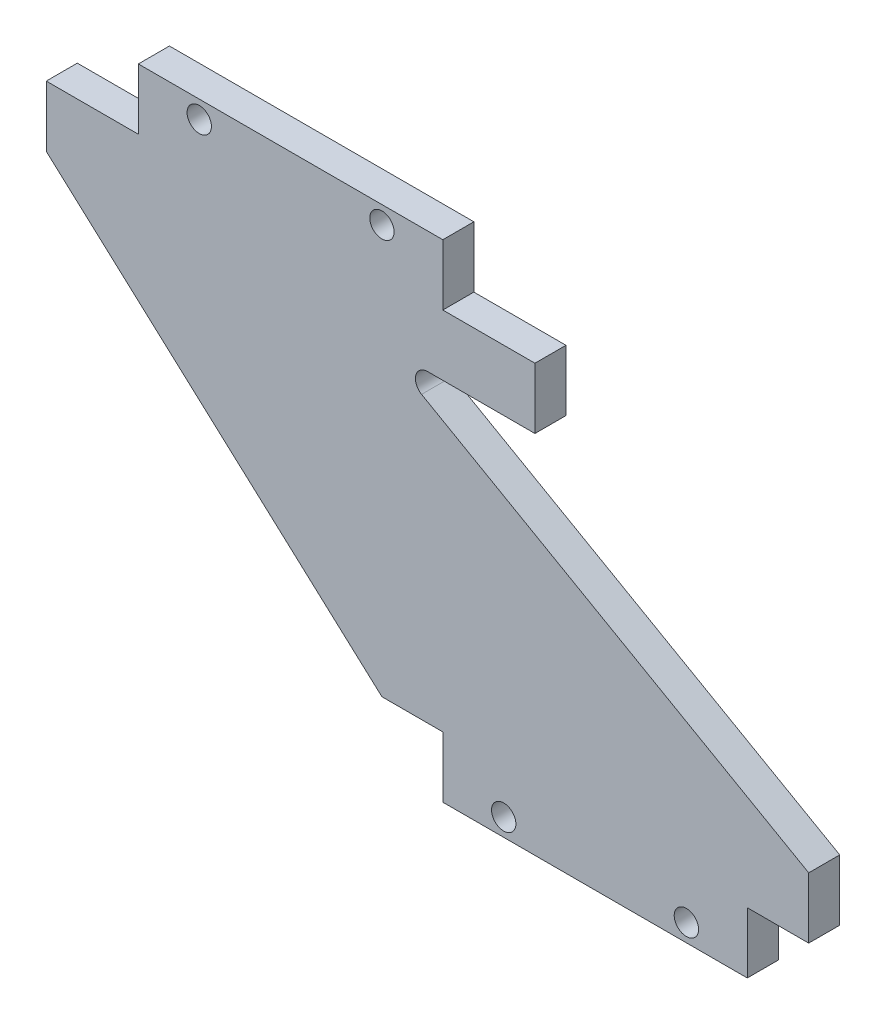
ISO-10303-21;
HEADER;
FILE_DESCRIPTION(('STEP AP214'),'2;1');
FILE_NAME('part.step','',(''),(''),'','','');
FILE_SCHEMA(('AUTOMOTIVE_DESIGN { 1 0 10303 214 1 1 1 1 }'));
ENDSEC;
DATA;
#1=APPLICATION_CONTEXT('core data for automotive mechanical design processes');
#2=APPLICATION_PROTOCOL_DEFINITION('international standard','automotive_design',2000,#1);
#3=PRODUCT_CONTEXT('',#1,'mechanical');
#4=PRODUCT('Part','Part','',(#3));
#5=PRODUCT_RELATED_PRODUCT_CATEGORY('part','',(#4));
#6=PRODUCT_DEFINITION_FORMATION('','',#4);
#7=PRODUCT_DEFINITION_CONTEXT('part definition',#1,'design');
#8=PRODUCT_DEFINITION('design','',#6,#7);
#9=PRODUCT_DEFINITION_SHAPE('','',#8);
#10=(LENGTH_UNIT() NAMED_UNIT(*) SI_UNIT(.MILLI.,.METRE.));
#11=(NAMED_UNIT(*) PLANE_ANGLE_UNIT() SI_UNIT($,.RADIAN.));
#12=(NAMED_UNIT(*) SI_UNIT($,.STERADIAN.) SOLID_ANGLE_UNIT());
#13=UNCERTAINTY_MEASURE_WITH_UNIT(LENGTH_MEASURE(1.E-05),#10,'distance_accuracy_value','');
#14=(GEOMETRIC_REPRESENTATION_CONTEXT(3) GLOBAL_UNCERTAINTY_ASSIGNED_CONTEXT((#13)) GLOBAL_UNIT_ASSIGNED_CONTEXT((#10,
#11,#12)) REPRESENTATION_CONTEXT('',''));
#15=CARTESIAN_POINT('',(0.,0.,0.));
#16=DIRECTION('',(0.,0.,1.));
#17=DIRECTION('',(1.,0.,0.));
#18=AXIS2_PLACEMENT_3D('',#15,#16,#17);
#19=CARTESIAN_POINT('',(5.01373967567587,40.1015639589169,5.1));
#20=DIRECTION('',(0.,0.,1.));
#21=DIRECTION('',(1.,0.,0.));
#22=AXIS2_PLACEMENT_3D('',#19,#20,#21);
#23=PLANE('',#22);
#24=CARTESIAN_POINT('',(17.5157498184459,-14.9984360410831,5.1));
#25=DIRECTION('',(0.,0.,1.));
#26=DIRECTION('',(1.,0.,0.));
#27=AXIS2_PLACEMENT_3D('',#24,#25,#26);
#28=CIRCLE('',#27,2.);
#29=CARTESIAN_POINT('',(19.5157498184459,-14.9984360410831,5.1));
#30=VERTEX_POINT('',#29);
#31=EDGE_CURVE('E356',#30,#30,#28,.T.);
#32=ORIENTED_EDGE('',*,*,#31,.F.);
#33=EDGE_LOOP('',(#32));
#34=FACE_BOUND('',#33,.T.);
#35=CARTESIAN_POINT('',(-32.4842501815541,59.2015639589169,5.1));
#36=DIRECTION('',(0.,0.,1.));
#37=DIRECTION('',(1.,0.,0.));
#38=AXIS2_PLACEMENT_3D('',#35,#36,#37);
#39=CIRCLE('',#38,2.);
#40=CARTESIAN_POINT('',(-30.4842501815541,59.2015639589169,5.1));
#41=VERTEX_POINT('',#40);
#42=EDGE_CURVE('E188',#41,#41,#39,.T.);
#43=ORIENTED_EDGE('',*,*,#42,.F.);
#44=EDGE_LOOP('',(#43));
#45=FACE_BOUND('',#44,.T.);
#46=DIRECTION('',(-1.,0.,0.));
#47=VECTOR('',#46,1.);
#48=CARTESIAN_POINT('',(7.5157498184459,62.1015639589169,5.1));
#49=LINE('',#48,#47);
#50=CARTESIAN_POINT('',(7.5157498184459,62.1015639589169,5.1));
#51=VERTEX_POINT('',#50);
#52=CARTESIAN_POINT('',(-42.4842501815541,62.1015639589169,5.1));
#53=VERTEX_POINT('',#52);
#54=EDGE_CURVE('E217',#51,#53,#49,.T.);
#55=ORIENTED_EDGE('',*,*,#54,.T.);
#56=DIRECTION('',(0.,-1.,0.));
#57=VECTOR('',#56,1.);
#58=CARTESIAN_POINT('',(-42.4842501815541,62.1015639589169,5.1));
#59=LINE('',#58,#57);
#60=CARTESIAN_POINT('',(-42.4842501815541,52.1015639589169,5.1));
#61=VERTEX_POINT('',#60);
#62=EDGE_CURVE('E120',#53,#61,#59,.T.);
#63=ORIENTED_EDGE('',*,*,#62,.T.);
#64=DIRECTION('',(-1.,0.,0.));
#65=VECTOR('',#64,1.);
#66=CARTESIAN_POINT('',(-42.4842501815541,52.1015639589169,5.1));
#67=LINE('',#66,#65);
#68=CARTESIAN_POINT('',(-57.6105106857558,52.1015639589169,5.1));
#69=VERTEX_POINT('',#68);
#70=EDGE_CURVE('E259',#61,#69,#67,.T.);
#71=ORIENTED_EDGE('',*,*,#70,.T.);
#72=DIRECTION('',(0.,-1.,0.));
#73=VECTOR('',#72,1.);
#74=CARTESIAN_POINT('',(-57.6105106857558,52.1015639589169,5.1));
#75=LINE('',#74,#73);
#76=CARTESIAN_POINT('',(-57.6105106857558,42.1015639589169,5.1));
#77=VERTEX_POINT('',#76);
#78=EDGE_CURVE('E278',#69,#77,#75,.T.);
#79=ORIENTED_EDGE('',*,*,#78,.T.);
#80=DIRECTION('',(0.74070724166156,-0.67182794088228,0.));
#81=VECTOR('',#80,1.);
#82=CARTESIAN_POINT('',(-57.6105106857558,42.1015639589169,5.1));
#83=LINE('',#82,#81);
#84=CARTESIAN_POINT('',(-2.4842501815541,-7.89843604108308,5.1));
#85=VERTEX_POINT('',#84);
#86=EDGE_CURVE('E275',#77,#85,#83,.T.);
#87=ORIENTED_EDGE('',*,*,#86,.T.);
#88=DIRECTION('',(1.,0.,0.));
#89=VECTOR('',#88,1.);
#90=CARTESIAN_POINT('',(-2.4842501815541,-7.89843604108308,5.1));
#91=LINE('',#90,#89);
#92=CARTESIAN_POINT('',(7.51574981844591,-7.89843604108308,5.1));
#93=VERTEX_POINT('',#92);
#94=EDGE_CURVE('E277',#85,#93,#91,.T.);
#95=ORIENTED_EDGE('',*,*,#94,.T.);
#96=DIRECTION('',(0.,-1.,0.));
#97=VECTOR('',#96,1.);
#98=CARTESIAN_POINT('',(7.51574981844591,-7.89843604108308,5.1));
#99=LINE('',#98,#97);
#100=CARTESIAN_POINT('',(7.51574981844591,-17.8984360410831,5.1));
#101=VERTEX_POINT('',#100);
#102=EDGE_CURVE('E280',#93,#101,#99,.T.);
#103=ORIENTED_EDGE('',*,*,#102,.T.);
#104=DIRECTION('',(1.,0.,0.));
#105=VECTOR('',#104,1.);
#106=CARTESIAN_POINT('',(7.51574981844591,-17.8984360410831,5.1));
#107=LINE('',#106,#105);
#108=CARTESIAN_POINT('',(57.5157498184459,-17.8984360410831,5.1));
#109=VERTEX_POINT('',#108);
#110=EDGE_CURVE('E286',#101,#109,#107,.T.);
#111=ORIENTED_EDGE('',*,*,#110,.T.);
#112=DIRECTION('',(0.,1.,0.));
#113=VECTOR('',#112,1.);
#114=CARTESIAN_POINT('',(57.5157498184459,-17.8984360410831,5.1));
#115=LINE('',#114,#113);
#116=CARTESIAN_POINT('',(57.5157498184459,-7.89843604108309,5.1));
#117=VERTEX_POINT('',#116);
#118=EDGE_CURVE('E288',#109,#117,#115,.T.);
#119=ORIENTED_EDGE('',*,*,#118,.T.);
#120=DIRECTION('',(1.,0.,0.));
#121=VECTOR('',#120,1.);
#122=CARTESIAN_POINT('',(57.5157498184459,-7.89843604108309,5.1));
#123=LINE('',#122,#121);
#124=CARTESIAN_POINT('',(67.5999234879137,-7.89843604108309,5.1));
#125=VERTEX_POINT('',#124);
#126=EDGE_CURVE('E290',#117,#125,#123,.T.);
#127=ORIENTED_EDGE('',*,*,#126,.T.);
#128=DIRECTION('',(0.,1.,0.));
#129=VECTOR('',#128,1.);
#130=CARTESIAN_POINT('',(67.5999234879137,-7.89843604108309,5.1));
#131=LINE('',#130,#129);
#132=CARTESIAN_POINT('',(67.5999234879137,2.10156395891691,5.1));
#133=VERTEX_POINT('',#132);
#134=EDGE_CURVE('E292',#125,#133,#131,.T.);
#135=ORIENTED_EDGE('',*,*,#134,.T.);
#136=DIRECTION('',(-0.868637401964146,0.495448346358103,0.));
#137=VECTOR('',#136,1.);
#138=CARTESIAN_POINT('',(67.5999234879137,2.10156395891691,5.1));
#139=LINE('',#138,#137);
#140=CARTESIAN_POINT('',(4.02284298295967,38.3642891549886,5.1));
#141=VERTEX_POINT('',#140);
#142=EDGE_CURVE('E294',#133,#141,#139,.T.);
#143=ORIENTED_EDGE('',*,*,#142,.T.);
#144=CARTESIAN_POINT('',(5.01373967567587,40.1015639589169,5.1));
#145=DIRECTION('',(0.,0.,-1.));
#146=DIRECTION('',(1.,0.,0.));
#147=AXIS2_PLACEMENT_3D('',#144,#145,#146);
#148=CIRCLE('',#147,2.);
#149=CARTESIAN_POINT('',(5.01373967567587,42.1015639589169,5.1));
#150=VERTEX_POINT('',#149);
#151=EDGE_CURVE('E296',#141,#150,#148,.T.);
#152=ORIENTED_EDGE('',*,*,#151,.T.);
#153=DIRECTION('',(1.,0.,0.));
#154=VECTOR('',#153,1.);
#155=CARTESIAN_POINT('',(5.01373967567587,42.1015639589169,5.1));
#156=LINE('',#155,#154);
#157=CARTESIAN_POINT('',(22.6420103226476,42.1015639589169,5.1));
#158=VERTEX_POINT('',#157);
#159=EDGE_CURVE('E166',#150,#158,#156,.T.);
#160=ORIENTED_EDGE('',*,*,#159,.T.);
#161=DIRECTION('',(0.,1.,0.));
#162=VECTOR('',#161,1.);
#163=CARTESIAN_POINT('',(22.6420103226476,42.1015639589169,5.1));
#164=LINE('',#163,#162);
#165=CARTESIAN_POINT('',(22.6420103226476,52.1015639589169,5.1));
#166=VERTEX_POINT('',#165);
#167=EDGE_CURVE('E160',#158,#166,#164,.T.);
#168=ORIENTED_EDGE('',*,*,#167,.T.);
#169=DIRECTION('',(-1.,0.,0.));
#170=VECTOR('',#169,1.);
#171=CARTESIAN_POINT('',(22.6420103226476,52.1015639589169,5.1));
#172=LINE('',#171,#170);
#173=CARTESIAN_POINT('',(7.5157498184459,52.1015639589169,5.1));
#174=VERTEX_POINT('',#173);
#175=EDGE_CURVE('E164',#166,#174,#172,.T.);
#176=ORIENTED_EDGE('',*,*,#175,.T.);
#177=DIRECTION('',(0.,1.,0.));
#178=VECTOR('',#177,1.);
#179=CARTESIAN_POINT('',(7.5157498184459,52.1015639589169,5.1));
#180=LINE('',#179,#178);
#181=EDGE_CURVE('E50',#174,#51,#180,.T.);
#182=ORIENTED_EDGE('',*,*,#181,.T.);
#183=EDGE_LOOP('',(#55,#63,#71,#79,#87,#95,#103,#111,#119,#127,#135,#143,#152,#160,#168,#176,#182));
#184=FACE_BOUND('',#183,.T.);
#185=CARTESIAN_POINT('',(-2.4842501815541,59.2015639589169,5.1));
#186=DIRECTION('',(0.,0.,1.));
#187=DIRECTION('',(1.,0.,0.));
#188=AXIS2_PLACEMENT_3D('',#185,#186,#187);
#189=CIRCLE('',#188,2.);
#190=CARTESIAN_POINT('',(-0.484250181554103,59.2015639589169,5.1));
#191=VERTEX_POINT('',#190);
#192=EDGE_CURVE('E362',#191,#191,#189,.T.);
#193=ORIENTED_EDGE('',*,*,#192,.F.);
#194=EDGE_LOOP('',(#193));
#195=FACE_BOUND('',#194,.T.);
#196=CARTESIAN_POINT('',(47.5157498184459,-14.9984360410831,5.1));
#197=DIRECTION('',(0.,0.,1.));
#198=DIRECTION('',(1.,0.,0.));
#199=AXIS2_PLACEMENT_3D('',#196,#197,#198);
#200=CIRCLE('',#199,2.);
#201=CARTESIAN_POINT('',(49.5157498184459,-14.9984360410831,5.1));
#202=VERTEX_POINT('',#201);
#203=EDGE_CURVE('E347',#202,#202,#200,.T.);
#204=ORIENTED_EDGE('',*,*,#203,.F.);
#205=EDGE_LOOP('',(#204));
#206=FACE_BOUND('',#205,.T.);
#207=ADVANCED_FACE('F33',(#34,#45,#184,#195,#206),#23,.T.);
#208=CARTESIAN_POINT('',(5.01373967567587,40.1015639589169,0.));
#209=DIRECTION('',(0.,0.,1.));
#210=DIRECTION('',(1.,0.,0.));
#211=AXIS2_PLACEMENT_3D('',#208,#209,#210);
#212=PLANE('',#211);
#213=DIRECTION('',(-1.,0.,0.));
#214=VECTOR('',#213,1.);
#215=CARTESIAN_POINT('',(7.5157498184459,62.1015639589169,0.));
#216=LINE('',#215,#214);
#217=CARTESIAN_POINT('',(7.5157498184459,62.1015639589169,0.));
#218=VERTEX_POINT('',#217);
#219=CARTESIAN_POINT('',(-42.4842501815541,62.1015639589169,0.));
#220=VERTEX_POINT('',#219);
#221=EDGE_CURVE('E184',#218,#220,#216,.T.);
#222=ORIENTED_EDGE('',*,*,#221,.F.);
#223=DIRECTION('',(0.,1.,0.));
#224=VECTOR('',#223,1.);
#225=CARTESIAN_POINT('',(7.5157498184459,52.1015639589169,0.));
#226=LINE('',#225,#224);
#227=CARTESIAN_POINT('',(7.5157498184459,52.1015639589169,0.));
#228=VERTEX_POINT('',#227);
#229=EDGE_CURVE('E112',#228,#218,#226,.T.);
#230=ORIENTED_EDGE('',*,*,#229,.F.);
#231=DIRECTION('',(-1.,0.,0.));
#232=VECTOR('',#231,1.);
#233=CARTESIAN_POINT('',(22.6420103226476,52.1015639589169,0.));
#234=LINE('',#233,#232);
#235=CARTESIAN_POINT('',(22.6420103226476,52.1015639589169,0.));
#236=VERTEX_POINT('',#235);
#237=EDGE_CURVE('E106',#236,#228,#234,.T.);
#238=ORIENTED_EDGE('',*,*,#237,.F.);
#239=DIRECTION('',(0.,1.,0.));
#240=VECTOR('',#239,1.);
#241=CARTESIAN_POINT('',(22.6420103226476,42.1015639589169,0.));
#242=LINE('',#241,#240);
#243=CARTESIAN_POINT('',(22.6420103226476,42.1015639589169,0.));
#244=VERTEX_POINT('',#243);
#245=EDGE_CURVE('E174',#244,#236,#242,.T.);
#246=ORIENTED_EDGE('',*,*,#245,.F.);
#247=DIRECTION('',(1.,0.,0.));
#248=VECTOR('',#247,1.);
#249=CARTESIAN_POINT('',(5.01373967567587,42.1015639589169,0.));
#250=LINE('',#249,#248);
#251=CARTESIAN_POINT('',(5.01373967567587,42.1015639589169,0.));
#252=VERTEX_POINT('',#251);
#253=EDGE_CURVE('E212',#252,#244,#250,.T.);
#254=ORIENTED_EDGE('',*,*,#253,.F.);
#255=CARTESIAN_POINT('',(5.01373967567587,40.1015639589169,0.));
#256=DIRECTION('',(0.,0.,-1.));
#257=DIRECTION('',(1.,0.,0.));
#258=AXIS2_PLACEMENT_3D('',#255,#256,#257);
#259=CIRCLE('',#258,2.);
#260=CARTESIAN_POINT('',(4.02284298295967,38.3642891549886,0.));
#261=VERTEX_POINT('',#260);
#262=EDGE_CURVE('E210',#261,#252,#259,.T.);
#263=ORIENTED_EDGE('',*,*,#262,.F.);
#264=DIRECTION('',(-0.868637401964146,0.495448346358103,0.));
#265=VECTOR('',#264,1.);
#266=CARTESIAN_POINT('',(67.5999234879137,2.10156395891691,0.));
#267=LINE('',#266,#265);
#268=CARTESIAN_POINT('',(67.5999234879137,2.10156395891691,0.));
#269=VERTEX_POINT('',#268);
#270=EDGE_CURVE('E208',#269,#261,#267,.T.);
#271=ORIENTED_EDGE('',*,*,#270,.F.);
#272=DIRECTION('',(0.,1.,0.));
#273=VECTOR('',#272,1.);
#274=CARTESIAN_POINT('',(67.5999234879137,-7.89843604108309,0.));
#275=LINE('',#274,#273);
#276=CARTESIAN_POINT('',(67.5999234879137,-7.89843604108309,0.));
#277=VERTEX_POINT('',#276);
#278=EDGE_CURVE('E206',#277,#269,#275,.T.);
#279=ORIENTED_EDGE('',*,*,#278,.F.);
#280=DIRECTION('',(1.,0.,0.));
#281=VECTOR('',#280,1.);
#282=CARTESIAN_POINT('',(57.5157498184459,-7.89843604108309,0.));
#283=LINE('',#282,#281);
#284=CARTESIAN_POINT('',(57.5157498184459,-7.89843604108309,0.));
#285=VERTEX_POINT('',#284);
#286=EDGE_CURVE('E204',#285,#277,#283,.T.);
#287=ORIENTED_EDGE('',*,*,#286,.F.);
#288=DIRECTION('',(0.,1.,0.));
#289=VECTOR('',#288,1.);
#290=CARTESIAN_POINT('',(57.5157498184459,-17.8984360410831,0.));
#291=LINE('',#290,#289);
#292=CARTESIAN_POINT('',(57.5157498184459,-17.8984360410831,0.));
#293=VERTEX_POINT('',#292);
#294=EDGE_CURVE('E202',#293,#285,#291,.T.);
#295=ORIENTED_EDGE('',*,*,#294,.F.);
#296=DIRECTION('',(1.,0.,0.));
#297=VECTOR('',#296,1.);
#298=CARTESIAN_POINT('',(7.51574981844591,-17.8984360410831,0.));
#299=LINE('',#298,#297);
#300=CARTESIAN_POINT('',(7.51574981844591,-17.8984360410831,0.));
#301=VERTEX_POINT('',#300);
#302=EDGE_CURVE('E200',#301,#293,#299,.T.);
#303=ORIENTED_EDGE('',*,*,#302,.F.);
#304=DIRECTION('',(0.,-1.,0.));
#305=VECTOR('',#304,1.);
#306=CARTESIAN_POINT('',(7.51574981844591,-7.89843604108308,0.));
#307=LINE('',#306,#305);
#308=CARTESIAN_POINT('',(7.51574981844591,-7.89843604108308,0.));
#309=VERTEX_POINT('',#308);
#310=EDGE_CURVE('E198',#309,#301,#307,.T.);
#311=ORIENTED_EDGE('',*,*,#310,.F.);
#312=DIRECTION('',(1.,0.,0.));
#313=VECTOR('',#312,1.);
#314=CARTESIAN_POINT('',(-2.4842501815541,-7.89843604108308,0.));
#315=LINE('',#314,#313);
#316=CARTESIAN_POINT('',(-2.4842501815541,-7.89843604108308,0.));
#317=VERTEX_POINT('',#316);
#318=EDGE_CURVE('E196',#317,#309,#315,.T.);
#319=ORIENTED_EDGE('',*,*,#318,.F.);
#320=DIRECTION('',(0.74070724166156,-0.67182794088228,0.));
#321=VECTOR('',#320,1.);
#322=CARTESIAN_POINT('',(-57.6105106857558,42.1015639589169,0.));
#323=LINE('',#322,#321);
#324=CARTESIAN_POINT('',(-57.6105106857558,42.1015639589169,0.));
#325=VERTEX_POINT('',#324);
#326=EDGE_CURVE('E194',#325,#317,#323,.T.);
#327=ORIENTED_EDGE('',*,*,#326,.F.);
#328=DIRECTION('',(0.,-1.,0.));
#329=VECTOR('',#328,1.);
#330=CARTESIAN_POINT('',(-57.6105106857558,52.1015639589169,0.));
#331=LINE('',#330,#329);
#332=CARTESIAN_POINT('',(-57.6105106857558,52.1015639589169,0.));
#333=VERTEX_POINT('',#332);
#334=EDGE_CURVE('E192',#333,#325,#331,.T.);
#335=ORIENTED_EDGE('',*,*,#334,.F.);
#336=DIRECTION('',(-1.,0.,0.));
#337=VECTOR('',#336,1.);
#338=CARTESIAN_POINT('',(-42.4842501815541,52.1015639589169,0.));
#339=LINE('',#338,#337);
#340=CARTESIAN_POINT('',(-42.4842501815541,52.1015639589169,0.));
#341=VERTEX_POINT('',#340);
#342=EDGE_CURVE('E190',#341,#333,#339,.T.);
#343=ORIENTED_EDGE('',*,*,#342,.F.);
#344=DIRECTION('',(0.,-1.,0.));
#345=VECTOR('',#344,1.);
#346=CARTESIAN_POINT('',(-42.4842501815541,62.1015639589169,0.));
#347=LINE('',#346,#345);
#348=EDGE_CURVE('E187',#220,#341,#347,.T.);
#349=ORIENTED_EDGE('',*,*,#348,.F.);
#350=EDGE_LOOP('',(#222,#230,#238,#246,#254,#263,#271,#279,#287,#295,#303,#311,#319,#327,#335,
#343,#349));
#351=FACE_BOUND('',#350,.T.);
#352=CARTESIAN_POINT('',(-32.4842501815541,59.2015639589169,0.));
#353=DIRECTION('',(0.,0.,1.));
#354=DIRECTION('',(1.,0.,0.));
#355=AXIS2_PLACEMENT_3D('',#352,#353,#354);
#356=CIRCLE('',#355,2.);
#357=CARTESIAN_POINT('',(-30.4842501815541,59.2015639589169,0.));
#358=VERTEX_POINT('',#357);
#359=EDGE_CURVE('E365',#358,#358,#356,.T.);
#360=ORIENTED_EDGE('',*,*,#359,.T.);
#361=EDGE_LOOP('',(#360));
#362=FACE_BOUND('',#361,.T.);
#363=CARTESIAN_POINT('',(-2.4842501815541,59.2015639589169,0.));
#364=DIRECTION('',(0.,0.,1.));
#365=DIRECTION('',(1.,0.,0.));
#366=AXIS2_PLACEMENT_3D('',#363,#364,#365);
#367=CIRCLE('',#366,2.);
#368=CARTESIAN_POINT('',(-0.484250181554103,59.2015639589169,0.));
#369=VERTEX_POINT('',#368);
#370=EDGE_CURVE('E359',#369,#369,#367,.T.);
#371=ORIENTED_EDGE('',*,*,#370,.T.);
#372=EDGE_LOOP('',(#371));
#373=FACE_BOUND('',#372,.T.);
#374=CARTESIAN_POINT('',(17.5157498184459,-14.9984360410831,0.));
#375=DIRECTION('',(0.,0.,1.));
#376=DIRECTION('',(1.,0.,0.));
#377=AXIS2_PLACEMENT_3D('',#374,#375,#376);
#378=CIRCLE('',#377,2.);
#379=CARTESIAN_POINT('',(19.5157498184459,-14.9984360410831,0.));
#380=VERTEX_POINT('',#379);
#381=EDGE_CURVE('E353',#380,#380,#378,.T.);
#382=ORIENTED_EDGE('',*,*,#381,.T.);
#383=EDGE_LOOP('',(#382));
#384=FACE_BOUND('',#383,.T.);
#385=CARTESIAN_POINT('',(47.5157498184459,-14.9984360410831,0.));
#386=DIRECTION('',(0.,0.,1.));
#387=DIRECTION('',(1.,0.,0.));
#388=AXIS2_PLACEMENT_3D('',#385,#386,#387);
#389=CIRCLE('',#388,2.);
#390=CARTESIAN_POINT('',(49.5157498184459,-14.9984360410831,0.));
#391=VERTEX_POINT('',#390);
#392=EDGE_CURVE('E350',#391,#391,#389,.T.);
#393=ORIENTED_EDGE('',*,*,#392,.T.);
#394=EDGE_LOOP('',(#393));
#395=FACE_BOUND('',#394,.T.);
#396=ADVANCED_FACE('F263',(#351,#362,#373,#384,#395),#212,.F.);
#397=CARTESIAN_POINT('',(7.5157498184459,62.1015639589169,5.1));
#398=DIRECTION('',(0.,-1.,0.));
#399=DIRECTION('',(1.,0.,0.));
#400=AXIS2_PLACEMENT_3D('',#397,#398,#399);
#401=PLANE('',#400);
#402=ORIENTED_EDGE('',*,*,#221,.T.);
#403=DIRECTION('',(0.,0.,-1.));
#404=VECTOR('',#403,1.);
#405=CARTESIAN_POINT('',(-42.4842501815541,62.1015639589169,5.1));
#406=LINE('',#405,#404);
#407=EDGE_CURVE('E11',#53,#220,#406,.T.);
#408=ORIENTED_EDGE('',*,*,#407,.F.);
#409=ORIENTED_EDGE('',*,*,#54,.F.);
#410=DIRECTION('',(0.,0.,-1.));
#411=VECTOR('',#410,1.);
#412=CARTESIAN_POINT('',(7.5157498184459,62.1015639589169,5.1));
#413=LINE('',#412,#411);
#414=EDGE_CURVE('E180',#51,#218,#413,.T.);
#415=ORIENTED_EDGE('',*,*,#414,.T.);
#416=EDGE_LOOP('',(#402,#408,#409,#415));
#417=FACE_BOUND('',#416,.T.);
#418=ADVANCED_FACE('F35',(#417),#401,.F.);
#419=CARTESIAN_POINT('',(-42.4842501815541,62.1015639589169,5.1));
#420=DIRECTION('',(1.,0.,0.));
#421=DIRECTION('',(0.,0.,-1.));
#422=AXIS2_PLACEMENT_3D('',#419,#420,#421);
#423=PLANE('',#422);
#424=ORIENTED_EDGE('',*,*,#348,.T.);
#425=DIRECTION('',(0.,0.,-1.));
#426=VECTOR('',#425,1.);
#427=CARTESIAN_POINT('',(-42.4842501815541,52.1015639589169,5.1));
#428=LINE('',#427,#426);
#429=EDGE_CURVE('E42',#61,#341,#428,.T.);
#430=ORIENTED_EDGE('',*,*,#429,.F.);
#431=ORIENTED_EDGE('',*,*,#62,.F.);
#432=ORIENTED_EDGE('',*,*,#407,.T.);
#433=EDGE_LOOP('',(#424,#430,#431,#432));
#434=FACE_BOUND('',#433,.T.);
#435=ADVANCED_FACE('F525',(#434),#423,.F.);
#436=CARTESIAN_POINT('',(-42.4842501815541,52.1015639589169,5.1));
#437=DIRECTION('',(0.,-1.,0.));
#438=DIRECTION('',(0.,0.,-1.));
#439=AXIS2_PLACEMENT_3D('',#436,#437,#438);
#440=PLANE('',#439);
#441=ORIENTED_EDGE('',*,*,#342,.T.);
#442=DIRECTION('',(0.,0.,-1.));
#443=VECTOR('',#442,1.);
#444=CARTESIAN_POINT('',(-57.6105106857558,52.1015639589169,5.1));
#445=LINE('',#444,#443);
#446=EDGE_CURVE('E251',#69,#333,#445,.T.);
#447=ORIENTED_EDGE('',*,*,#446,.F.);
#448=ORIENTED_EDGE('',*,*,#70,.F.);
#449=ORIENTED_EDGE('',*,*,#429,.T.);
#450=EDGE_LOOP('',(#441,#447,#448,#449));
#451=FACE_BOUND('',#450,.T.);
#452=ADVANCED_FACE('F257',(#451),#440,.F.);
#453=CARTESIAN_POINT('',(-57.6105106857558,52.1015639589169,5.1));
#454=DIRECTION('',(1.,0.,0.));
#455=DIRECTION('',(0.,0.,-1.));
#456=AXIS2_PLACEMENT_3D('',#453,#454,#455);
#457=PLANE('',#456);
#458=ORIENTED_EDGE('',*,*,#334,.T.);
#459=DIRECTION('',(0.,0.,-1.));
#460=VECTOR('',#459,1.);
#461=CARTESIAN_POINT('',(-57.6105106857558,42.1015639589169,5.1));
#462=LINE('',#461,#460);
#463=EDGE_CURVE('E248',#77,#325,#462,.T.);
#464=ORIENTED_EDGE('',*,*,#463,.F.);
#465=ORIENTED_EDGE('',*,*,#78,.F.);
#466=ORIENTED_EDGE('',*,*,#446,.T.);
#467=EDGE_LOOP('',(#458,#464,#465,#466));
#468=FACE_BOUND('',#467,.T.);
#469=ADVANCED_FACE('F269',(#468),#457,.F.);
#470=CARTESIAN_POINT('',(-57.6105106857558,42.1015639589169,5.1));
#471=DIRECTION('',(0.67182794088228,0.74070724166156,0.));
#472=DIRECTION('',(-0.74070724166156,0.67182794088228,0.));
#473=AXIS2_PLACEMENT_3D('',#470,#471,#472);
#474=PLANE('',#473);
#475=ORIENTED_EDGE('',*,*,#326,.T.);
#476=DIRECTION('',(0.,0.,-1.));
#477=VECTOR('',#476,1.);
#478=CARTESIAN_POINT('',(-2.4842501815541,-7.89843604108308,5.1));
#479=LINE('',#478,#477);
#480=EDGE_CURVE('E245',#85,#317,#479,.T.);
#481=ORIENTED_EDGE('',*,*,#480,.F.);
#482=ORIENTED_EDGE('',*,*,#86,.F.);
#483=ORIENTED_EDGE('',*,*,#463,.T.);
#484=EDGE_LOOP('',(#475,#481,#482,#483));
#485=FACE_BOUND('',#484,.T.);
#486=ADVANCED_FACE('F273',(#485),#474,.F.);
#487=CARTESIAN_POINT('',(-2.4842501815541,-7.89843604108308,5.1));
#488=DIRECTION('',(0.,1.,0.));
#489=DIRECTION('',(0.,0.,1.));
#490=AXIS2_PLACEMENT_3D('',#487,#488,#489);
#491=PLANE('',#490);
#492=ORIENTED_EDGE('',*,*,#318,.T.);
#493=DIRECTION('',(0.,0.,-1.));
#494=VECTOR('',#493,1.);
#495=CARTESIAN_POINT('',(7.51574981844591,-7.89843604108308,5.1));
#496=LINE('',#495,#494);
#497=EDGE_CURVE('E242',#93,#309,#496,.T.);
#498=ORIENTED_EDGE('',*,*,#497,.F.);
#499=ORIENTED_EDGE('',*,*,#94,.F.);
#500=ORIENTED_EDGE('',*,*,#480,.T.);
#501=EDGE_LOOP('',(#492,#498,#499,#500));
#502=FACE_BOUND('',#501,.T.);
#503=ADVANCED_FACE('F490',(#502),#491,.F.);
#504=CARTESIAN_POINT('',(7.51574981844591,-7.89843604108308,5.1));
#505=DIRECTION('',(1.,0.,0.));
#506=DIRECTION('',(0.,0.,-1.));
#507=AXIS2_PLACEMENT_3D('',#504,#505,#506);
#508=PLANE('',#507);
#509=ORIENTED_EDGE('',*,*,#310,.T.);
#510=DIRECTION('',(0.,0.,-1.));
#511=VECTOR('',#510,1.);
#512=CARTESIAN_POINT('',(7.51574981844591,-17.8984360410831,5.1));
#513=LINE('',#512,#511);
#514=EDGE_CURVE('E239',#101,#301,#513,.T.);
#515=ORIENTED_EDGE('',*,*,#514,.F.);
#516=ORIENTED_EDGE('',*,*,#102,.F.);
#517=ORIENTED_EDGE('',*,*,#497,.T.);
#518=EDGE_LOOP('',(#509,#515,#516,#517));
#519=FACE_BOUND('',#518,.T.);
#520=ADVANCED_FACE('F480',(#519),#508,.F.);
#521=CARTESIAN_POINT('',(7.51574981844591,-17.8984360410831,5.1));
#522=DIRECTION('',(0.,1.,0.));
#523=DIRECTION('',(-1.,0.,0.));
#524=AXIS2_PLACEMENT_3D('',#521,#522,#523);
#525=PLANE('',#524);
#526=ORIENTED_EDGE('',*,*,#302,.T.);
#527=DIRECTION('',(0.,0.,-1.));
#528=VECTOR('',#527,1.);
#529=CARTESIAN_POINT('',(57.5157498184459,-17.8984360410831,5.1));
#530=LINE('',#529,#528);
#531=EDGE_CURVE('E236',#109,#293,#530,.T.);
#532=ORIENTED_EDGE('',*,*,#531,.F.);
#533=ORIENTED_EDGE('',*,*,#110,.F.);
#534=ORIENTED_EDGE('',*,*,#514,.T.);
#535=EDGE_LOOP('',(#526,#532,#533,#534));
#536=FACE_BOUND('',#535,.T.);
#537=ADVANCED_FACE('F470',(#536),#525,.F.);
#538=CARTESIAN_POINT('',(57.5157498184459,-17.8984360410831,5.1));
#539=DIRECTION('',(-1.,0.,0.));
#540=DIRECTION('',(0.,-1.,0.));
#541=AXIS2_PLACEMENT_3D('',#538,#539,#540);
#542=PLANE('',#541);
#543=ORIENTED_EDGE('',*,*,#294,.T.);
#544=DIRECTION('',(0.,0.,-1.));
#545=VECTOR('',#544,1.);
#546=CARTESIAN_POINT('',(57.5157498184459,-7.89843604108309,5.1));
#547=LINE('',#546,#545);
#548=EDGE_CURVE('E233',#117,#285,#547,.T.);
#549=ORIENTED_EDGE('',*,*,#548,.F.);
#550=ORIENTED_EDGE('',*,*,#118,.F.);
#551=ORIENTED_EDGE('',*,*,#531,.T.);
#552=EDGE_LOOP('',(#543,#549,#550,#551));
#553=FACE_BOUND('',#552,.T.);
#554=ADVANCED_FACE('F460',(#553),#542,.F.);
#555=CARTESIAN_POINT('',(57.5157498184459,-7.89843604108309,5.1));
#556=DIRECTION('',(0.,1.,0.));
#557=DIRECTION('',(0.,0.,1.));
#558=AXIS2_PLACEMENT_3D('',#555,#556,#557);
#559=PLANE('',#558);
#560=ORIENTED_EDGE('',*,*,#286,.T.);
#561=DIRECTION('',(0.,0.,-1.));
#562=VECTOR('',#561,1.);
#563=CARTESIAN_POINT('',(67.5999234879137,-7.89843604108309,5.1));
#564=LINE('',#563,#562);
#565=EDGE_CURVE('E230',#125,#277,#564,.T.);
#566=ORIENTED_EDGE('',*,*,#565,.F.);
#567=ORIENTED_EDGE('',*,*,#126,.F.);
#568=ORIENTED_EDGE('',*,*,#548,.T.);
#569=EDGE_LOOP('',(#560,#566,#567,#568));
#570=FACE_BOUND('',#569,.T.);
#571=ADVANCED_FACE('F450',(#570),#559,.F.);
#572=CARTESIAN_POINT('',(67.5999234879137,-7.89843604108309,5.1));
#573=DIRECTION('',(-1.,0.,0.));
#574=DIRECTION('',(0.,0.,1.));
#575=AXIS2_PLACEMENT_3D('',#572,#573,#574);
#576=PLANE('',#575);
#577=ORIENTED_EDGE('',*,*,#278,.T.);
#578=DIRECTION('',(0.,0.,-1.));
#579=VECTOR('',#578,1.);
#580=CARTESIAN_POINT('',(67.5999234879137,2.10156395891691,5.1));
#581=LINE('',#580,#579);
#582=EDGE_CURVE('E227',#133,#269,#581,.T.);
#583=ORIENTED_EDGE('',*,*,#582,.F.);
#584=ORIENTED_EDGE('',*,*,#134,.F.);
#585=ORIENTED_EDGE('',*,*,#565,.T.);
#586=EDGE_LOOP('',(#577,#583,#584,#585));
#587=FACE_BOUND('',#586,.T.);
#588=ADVANCED_FACE('F440',(#587),#576,.F.);
#589=CARTESIAN_POINT('',(67.5999234879137,2.10156395891691,5.1));
#590=DIRECTION('',(-0.495448346358103,-0.868637401964146,0.));
#591=DIRECTION('',(0.868637401964146,-0.495448346358103,0.));
#592=AXIS2_PLACEMENT_3D('',#589,#590,#591);
#593=PLANE('',#592);
#594=ORIENTED_EDGE('',*,*,#270,.T.);
#595=DIRECTION('',(0.,0.,-1.));
#596=VECTOR('',#595,1.);
#597=CARTESIAN_POINT('',(4.02284298295967,38.3642891549886,5.1));
#598=LINE('',#597,#596);
#599=EDGE_CURVE('E224',#141,#261,#598,.T.);
#600=ORIENTED_EDGE('',*,*,#599,.F.);
#601=ORIENTED_EDGE('',*,*,#142,.F.);
#602=ORIENTED_EDGE('',*,*,#582,.T.);
#603=EDGE_LOOP('',(#594,#600,#601,#602));
#604=FACE_BOUND('',#603,.T.);
#605=ADVANCED_FACE('F431',(#604),#593,.F.);
#606=CARTESIAN_POINT('',(5.01373967567587,40.1015639589169,5.1));
#607=DIRECTION('',(0.,0.,-1.));
#608=DIRECTION('',(-1.,0.,0.));
#609=AXIS2_PLACEMENT_3D('',#606,#607,#608);
#610=CYLINDRICAL_SURFACE('',#609,2.);
#611=ORIENTED_EDGE('',*,*,#262,.T.);
#612=DIRECTION('',(0.,0.,-1.));
#613=VECTOR('',#612,1.);
#614=CARTESIAN_POINT('',(5.01373967567587,42.1015639589169,5.1));
#615=LINE('',#614,#613);
#616=EDGE_CURVE('E221',#150,#252,#615,.T.);
#617=ORIENTED_EDGE('',*,*,#616,.F.);
#618=ORIENTED_EDGE('',*,*,#151,.F.);
#619=ORIENTED_EDGE('',*,*,#599,.T.);
#620=EDGE_LOOP('',(#611,#617,#618,#619));
#621=FACE_BOUND('',#620,.T.);
#622=ADVANCED_FACE('F302',(#621),#610,.F.);
#623=CARTESIAN_POINT('',(5.01373967567587,42.1015639589169,5.1));
#624=DIRECTION('',(0.,1.,0.));
#625=DIRECTION('',(0.,0.,1.));
#626=AXIS2_PLACEMENT_3D('',#623,#624,#625);
#627=PLANE('',#626);
#628=ORIENTED_EDGE('',*,*,#253,.T.);
#629=DIRECTION('',(0.,0.,-1.));
#630=VECTOR('',#629,1.);
#631=CARTESIAN_POINT('',(22.6420103226476,42.1015639589169,5.1));
#632=LINE('',#631,#630);
#633=EDGE_CURVE('E175',#158,#244,#632,.T.);
#634=ORIENTED_EDGE('',*,*,#633,.F.);
#635=ORIENTED_EDGE('',*,*,#159,.F.);
#636=ORIENTED_EDGE('',*,*,#616,.T.);
#637=EDGE_LOOP('',(#628,#634,#635,#636));
#638=FACE_BOUND('',#637,.T.);
#639=ADVANCED_FACE('F306',(#638),#627,.F.);
#640=CARTESIAN_POINT('',(22.6420103226476,42.1015639589169,5.1));
#641=DIRECTION('',(-1.,0.,0.));
#642=DIRECTION('',(0.,-1.,0.));
#643=AXIS2_PLACEMENT_3D('',#640,#641,#642);
#644=PLANE('',#643);
#645=ORIENTED_EDGE('',*,*,#245,.T.);
#646=DIRECTION('',(0.,0.,-1.));
#647=VECTOR('',#646,1.);
#648=CARTESIAN_POINT('',(22.6420103226476,52.1015639589169,5.1));
#649=LINE('',#648,#647);
#650=EDGE_CURVE('E171',#166,#236,#649,.T.);
#651=ORIENTED_EDGE('',*,*,#650,.F.);
#652=ORIENTED_EDGE('',*,*,#167,.F.);
#653=ORIENTED_EDGE('',*,*,#633,.T.);
#654=EDGE_LOOP('',(#645,#651,#652,#653));
#655=FACE_BOUND('',#654,.T.);
#656=ADVANCED_FACE('F172',(#655),#644,.F.);
#657=CARTESIAN_POINT('',(22.6420103226476,52.1015639589169,5.1));
#658=DIRECTION('',(0.,-1.,0.));
#659=DIRECTION('',(0.,0.,-1.));
#660=AXIS2_PLACEMENT_3D('',#657,#658,#659);
#661=PLANE('',#660);
#662=ORIENTED_EDGE('',*,*,#237,.T.);
#663=DIRECTION('',(0.,0.,-1.));
#664=VECTOR('',#663,1.);
#665=CARTESIAN_POINT('',(7.5157498184459,52.1015639589169,5.1));
#666=LINE('',#665,#664);
#667=EDGE_CURVE('E176',#174,#228,#666,.T.);
#668=ORIENTED_EDGE('',*,*,#667,.F.);
#669=ORIENTED_EDGE('',*,*,#175,.F.);
#670=ORIENTED_EDGE('',*,*,#650,.T.);
#671=EDGE_LOOP('',(#662,#668,#669,#670));
#672=FACE_BOUND('',#671,.T.);
#673=ADVANCED_FACE('F178',(#672),#661,.F.);
#674=CARTESIAN_POINT('',(7.5157498184459,52.1015639589169,5.1));
#675=DIRECTION('',(-1.,0.,0.));
#676=DIRECTION('',(0.,0.,1.));
#677=AXIS2_PLACEMENT_3D('',#674,#675,#676);
#678=PLANE('',#677);
#679=ORIENTED_EDGE('',*,*,#229,.T.);
#680=ORIENTED_EDGE('',*,*,#414,.F.);
#681=ORIENTED_EDGE('',*,*,#181,.F.);
#682=ORIENTED_EDGE('',*,*,#667,.T.);
#683=EDGE_LOOP('',(#679,#680,#681,#682));
#684=FACE_BOUND('',#683,.T.);
#685=ADVANCED_FACE('F310',(#684),#678,.F.);
#686=CARTESIAN_POINT('',(-32.4842501815541,59.2015639589169,5.1));
#687=DIRECTION('',(0.,0.,-1.));
#688=DIRECTION('',(-1.,0.,0.));
#689=AXIS2_PLACEMENT_3D('',#686,#687,#688);
#690=CYLINDRICAL_SURFACE('',#689,2.);
#691=ORIENTED_EDGE('',*,*,#42,.T.);
#692=EDGE_LOOP('',(#691));
#693=FACE_BOUND('',#692,.T.);
#694=ORIENTED_EDGE('',*,*,#359,.F.);
#695=EDGE_LOOP('',(#694));
#696=FACE_BOUND('',#695,.T.);
#697=ADVANCED_FACE('F312',(#693,#696),#690,.F.);
#698=CARTESIAN_POINT('',(-2.4842501815541,59.2015639589169,5.1));
#699=DIRECTION('',(0.,0.,-1.));
#700=DIRECTION('',(-1.,0.,0.));
#701=AXIS2_PLACEMENT_3D('',#698,#699,#700);
#702=CYLINDRICAL_SURFACE('',#701,2.);
#703=ORIENTED_EDGE('',*,*,#192,.T.);
#704=EDGE_LOOP('',(#703));
#705=FACE_BOUND('',#704,.T.);
#706=ORIENTED_EDGE('',*,*,#370,.F.);
#707=EDGE_LOOP('',(#706));
#708=FACE_BOUND('',#707,.T.);
#709=ADVANCED_FACE('F318',(#705,#708),#702,.F.);
#710=CARTESIAN_POINT('',(17.5157498184459,-14.9984360410831,5.1));
#711=DIRECTION('',(0.,0.,-1.));
#712=DIRECTION('',(-1.,0.,0.));
#713=AXIS2_PLACEMENT_3D('',#710,#711,#712);
#714=CYLINDRICAL_SURFACE('',#713,2.);
#715=ORIENTED_EDGE('',*,*,#31,.T.);
#716=EDGE_LOOP('',(#715));
#717=FACE_BOUND('',#716,.T.);
#718=ORIENTED_EDGE('',*,*,#381,.F.);
#719=EDGE_LOOP('',(#718));
#720=FACE_BOUND('',#719,.T.);
#721=ADVANCED_FACE('F334',(#717,#720),#714,.F.);
#722=CARTESIAN_POINT('',(47.5157498184459,-14.9984360410831,5.1));
#723=DIRECTION('',(0.,0.,-1.));
#724=DIRECTION('',(-1.,0.,0.));
#725=AXIS2_PLACEMENT_3D('',#722,#723,#724);
#726=CYLINDRICAL_SURFACE('',#725,2.);
#727=ORIENTED_EDGE('',*,*,#203,.T.);
#728=EDGE_LOOP('',(#727));
#729=FACE_BOUND('',#728,.T.);
#730=ORIENTED_EDGE('',*,*,#392,.F.);
#731=EDGE_LOOP('',(#730));
#732=FACE_BOUND('',#731,.T.);
#733=ADVANCED_FACE('F338',(#729,#732),#726,.F.);
#734=CLOSED_SHELL('',(#207,#396,#418,#435,#452,#469,#486,#503,#520,#537,#554,#571,#588,#605,
#622,#639,#656,#673,#685,#697,#709,#721,#733));
#735=MANIFOLD_SOLID_BREP('B2',#734);
#736=ADVANCED_BREP_SHAPE_REPRESENTATION('',(#18,#735),#14);
#737=SHAPE_DEFINITION_REPRESENTATION(#9,#736);
ENDSEC;
END-ISO-10303-21;
